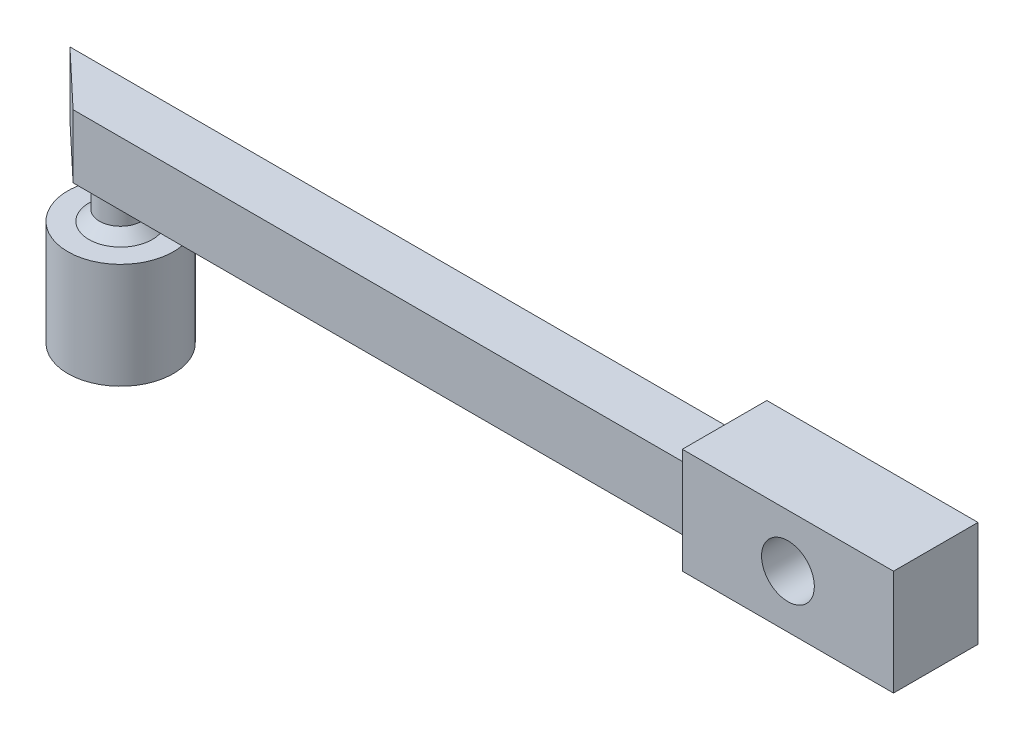
ISO-10303-21;
HEADER;
FILE_DESCRIPTION(('STEP AP214'),'2;1');
FILE_NAME('part.step','',(''),(''),'','','');
FILE_SCHEMA(('AUTOMOTIVE_DESIGN { 1 0 10303 214 1 1 1 1 }'));
ENDSEC;
DATA;
#1=APPLICATION_CONTEXT('core data for automotive mechanical design processes');
#2=APPLICATION_PROTOCOL_DEFINITION('international standard','automotive_design',2000,#1);
#3=PRODUCT_CONTEXT('',#1,'mechanical');
#4=PRODUCT('Part','Part','',(#3));
#5=PRODUCT_RELATED_PRODUCT_CATEGORY('part','',(#4));
#6=PRODUCT_DEFINITION_FORMATION('','',#4);
#7=PRODUCT_DEFINITION_CONTEXT('part definition',#1,'design');
#8=PRODUCT_DEFINITION('design','',#6,#7);
#9=PRODUCT_DEFINITION_SHAPE('','',#8);
#10=(LENGTH_UNIT() NAMED_UNIT(*) SI_UNIT(.MILLI.,.METRE.));
#11=(NAMED_UNIT(*) PLANE_ANGLE_UNIT() SI_UNIT($,.RADIAN.));
#12=(NAMED_UNIT(*) SI_UNIT($,.STERADIAN.) SOLID_ANGLE_UNIT());
#13=UNCERTAINTY_MEASURE_WITH_UNIT(LENGTH_MEASURE(1.E-05),#10,'distance_accuracy_value','');
#14=(GEOMETRIC_REPRESENTATION_CONTEXT(3) GLOBAL_UNCERTAINTY_ASSIGNED_CONTEXT((#13)) GLOBAL_UNIT_ASSIGNED_CONTEXT((#10,
#11,#12)) REPRESENTATION_CONTEXT('',''));
#15=CARTESIAN_POINT('',(0.,0.,0.));
#16=DIRECTION('',(0.,0.,1.));
#17=DIRECTION('',(1.,0.,0.));
#18=AXIS2_PLACEMENT_3D('',#15,#16,#17);
#19=CARTESIAN_POINT('',(-12.85,-8.2,1.25));
#20=DIRECTION('',(0.,1.,0.));
#21=DIRECTION('',(-1.,0.,0.));
#22=AXIS2_PLACEMENT_3D('',#19,#20,#21);
#23=CYLINDRICAL_SURFACE('',#22,2.5);
#24=DIRECTION('',(0.,-1.,0.));
#25=VECTOR('',#24,1.);
#26=CARTESIAN_POINT('',(-14.35,-0.158618734850889,-0.750000000000001));
#27=LINE('',#26,#25);
#28=CARTESIAN_POINT('',(-14.35,-3.2,-0.75));
#29=VERTEX_POINT('',#28);
#30=CARTESIAN_POINT('',(-14.35,-8.2,-0.750000000000001));
#31=VERTEX_POINT('',#30);
#32=EDGE_CURVE('E57',#29,#31,#27,.T.);
#33=ORIENTED_EDGE('',*,*,#32,.T.);
#34=CARTESIAN_POINT('',(-12.85,-8.2,1.25));
#35=DIRECTION('',(0.,-1.,0.));
#36=DIRECTION('',(1.,0.,0.));
#37=AXIS2_PLACEMENT_3D('',#34,#35,#36);
#38=CIRCLE('',#37,2.5);
#39=CARTESIAN_POINT('',(-11.35,-8.2,-0.750000000000001));
#40=VERTEX_POINT('',#39);
#41=EDGE_CURVE('E122',#40,#31,#38,.T.);
#42=ORIENTED_EDGE('',*,*,#41,.F.);
#43=DIRECTION('',(0.,-1.,0.));
#44=VECTOR('',#43,1.);
#45=CARTESIAN_POINT('',(-11.35,-0.158618734850889,-0.750000000000001));
#46=LINE('',#45,#44);
#47=CARTESIAN_POINT('',(-11.35,-3.2,-0.750000000000001));
#48=VERTEX_POINT('',#47);
#49=EDGE_CURVE('E114',#48,#40,#46,.T.);
#50=ORIENTED_EDGE('',*,*,#49,.F.);
#51=CARTESIAN_POINT('',(-12.85,-3.2,1.25));
#52=DIRECTION('',(0.,-1.,0.));
#53=DIRECTION('',(1.,0.,0.));
#54=AXIS2_PLACEMENT_3D('',#51,#52,#53);
#55=CIRCLE('',#54,2.5);
#56=EDGE_CURVE('E124',#48,#29,#55,.T.);
#57=ORIENTED_EDGE('',*,*,#56,.T.);
#58=EDGE_LOOP('',(#33,#42,#50,#57));
#59=FACE_BOUND('',#58,.T.);
#60=ADVANCED_FACE('F40',(#59),#23,.T.);
#61=CARTESIAN_POINT('',(-12.85,-8.2,1.25));
#62=DIRECTION('',(0.,-1.,0.));
#63=DIRECTION('',(1.,0.,0.));
#64=AXIS2_PLACEMENT_3D('',#61,#62,#63);
#65=PLANE('',#64);
#66=ORIENTED_EDGE('',*,*,#41,.T.);
#67=DIRECTION('',(1.,0.,0.));
#68=VECTOR('',#67,1.);
#69=CARTESIAN_POINT('',(0.,-8.2,-0.750000000000001));
#70=LINE('',#69,#68);
#71=EDGE_CURVE('E111',#31,#40,#70,.T.);
#72=ORIENTED_EDGE('',*,*,#71,.T.);
#73=EDGE_LOOP('',(#66,#72));
#74=FACE_BOUND('',#73,.T.);
#75=ADVANCED_FACE('F127',(#74),#65,.T.);
#76=CARTESIAN_POINT('',(-12.85,-3.2,1.25));
#77=DIRECTION('',(0.,-1.,0.));
#78=DIRECTION('',(1.,0.,0.));
#79=AXIS2_PLACEMENT_3D('',#76,#77,#78);
#80=PLANE('',#79);
#81=CARTESIAN_POINT('',(-12.85,-3.2,1.25));
#82=DIRECTION('',(0.,-1.,0.));
#83=DIRECTION('',(1.,0.,0.));
#84=AXIS2_PLACEMENT_3D('',#81,#82,#83);
#85=CIRCLE('',#84,1.5);
#86=CARTESIAN_POINT('',(-11.35,-3.2,1.25));
#87=VERTEX_POINT('',#86);
#88=EDGE_CURVE('E50',#87,#87,#85,.T.);
#89=ORIENTED_EDGE('',*,*,#88,.T.);
#90=EDGE_LOOP('',(#89));
#91=FACE_BOUND('',#90,.T.);
#92=DIRECTION('',(-1.,0.,0.));
#93=VECTOR('',#92,1.);
#94=CARTESIAN_POINT('',(0.,-3.2,-0.750000000000001));
#95=LINE('',#94,#93);
#96=EDGE_CURVE('E397',#48,#29,#95,.T.);
#97=ORIENTED_EDGE('',*,*,#96,.T.);
#98=ORIENTED_EDGE('',*,*,#56,.F.);
#99=EDGE_LOOP('',(#97,#98));
#100=FACE_BOUND('',#99,.T.);
#101=ADVANCED_FACE('F177',(#91,#100),#80,.F.);
#102=CARTESIAN_POINT('',(16.5,-1.5,2.5));
#103=DIRECTION('',(0.,1.,0.));
#104=DIRECTION('',(-1.,0.,0.));
#105=AXIS2_PLACEMENT_3D('',#102,#103,#104);
#106=PLANE('',#105);
#107=CARTESIAN_POINT('',(-12.85,-1.5,1.25));
#108=DIRECTION('',(0.,1.,0.));
#109=DIRECTION('',(-1.,0.,0.));
#110=AXIS2_PLACEMENT_3D('',#107,#108,#109);
#111=CIRCLE('',#110,1.);
#112=CARTESIAN_POINT('',(-13.85,-1.5,1.25));
#113=VERTEX_POINT('',#112);
#114=EDGE_CURVE('E170',#113,#113,#111,.F.);
#115=ORIENTED_EDGE('',*,*,#114,.F.);
#116=EDGE_LOOP('',(#115));
#117=FACE_BOUND('',#116,.T.);
#118=DIRECTION('',(1.,0.,0.));
#119=VECTOR('',#118,1.);
#120=CARTESIAN_POINT('',(16.5,-1.5,2.5));
#121=LINE('',#120,#119);
#122=CARTESIAN_POINT('',(-13.85,-1.5,2.5));
#123=VERTEX_POINT('',#122);
#124=CARTESIAN_POINT('',(16.5,-1.5,2.5));
#125=VERTEX_POINT('',#124);
#126=EDGE_CURVE('E148',#123,#125,#121,.T.);
#127=ORIENTED_EDGE('',*,*,#126,.F.);
#128=DIRECTION('',(0.727393652509462,0.,0.686220426895719));
#129=VECTOR('',#128,1.);
#130=CARTESIAN_POINT('',(-16.5,-1.5,0.));
#131=LINE('',#130,#129);
#132=CARTESIAN_POINT('',(-16.5,-1.5,0.));
#133=VERTEX_POINT('',#132);
#134=EDGE_CURVE('E129',#133,#123,#131,.T.);
#135=ORIENTED_EDGE('',*,*,#134,.F.);
#136=DIRECTION('',(1.,0.,0.));
#137=VECTOR('',#136,1.);
#138=CARTESIAN_POINT('',(16.5,-1.5,0.));
#139=LINE('',#138,#137);
#140=CARTESIAN_POINT('',(26.5,-1.5,0.));
#141=VERTEX_POINT('',#140);
#142=EDGE_CURVE('E162',#133,#141,#139,.T.);
#143=ORIENTED_EDGE('',*,*,#142,.T.);
#144=DIRECTION('',(0.,0.,-1.));
#145=VECTOR('',#144,1.);
#146=CARTESIAN_POINT('',(26.5,-1.5,4.));
#147=LINE('',#146,#145);
#148=CARTESIAN_POINT('',(26.5,-1.5,4.));
#149=VERTEX_POINT('',#148);
#150=EDGE_CURVE('E242',#149,#141,#147,.T.);
#151=ORIENTED_EDGE('',*,*,#150,.F.);
#152=DIRECTION('',(-1.,0.,0.));
#153=VECTOR('',#152,1.);
#154=CARTESIAN_POINT('',(26.5,-1.5,4.));
#155=LINE('',#154,#153);
#156=CARTESIAN_POINT('',(16.5,-1.5,4.));
#157=VERTEX_POINT('',#156);
#158=EDGE_CURVE('E249',#149,#157,#155,.T.);
#159=ORIENTED_EDGE('',*,*,#158,.T.);
#160=DIRECTION('',(0.,0.,-1.));
#161=VECTOR('',#160,1.);
#162=CARTESIAN_POINT('',(16.5,-1.5,4.));
#163=LINE('',#162,#161);
#164=EDGE_CURVE('E231',#157,#125,#163,.T.);
#165=ORIENTED_EDGE('',*,*,#164,.T.);
#166=EDGE_LOOP('',(#127,#135,#143,#151,#159,#165));
#167=FACE_BOUND('',#166,.T.);
#168=ADVANCED_FACE('F217',(#117,#167),#106,.F.);
#169=CARTESIAN_POINT('',(16.5,1.5,2.5));
#170=DIRECTION('',(0.,-1.,0.));
#171=DIRECTION('',(1.,0.,0.));
#172=AXIS2_PLACEMENT_3D('',#169,#170,#171);
#173=PLANE('',#172);
#174=DIRECTION('',(-1.,0.,0.));
#175=VECTOR('',#174,1.);
#176=CARTESIAN_POINT('',(16.5,1.5,0.));
#177=LINE('',#176,#175);
#178=CARTESIAN_POINT('',(16.5,1.5,0.));
#179=VERTEX_POINT('',#178);
#180=CARTESIAN_POINT('',(-16.5,1.5,0.));
#181=VERTEX_POINT('',#180);
#182=EDGE_CURVE('E153',#179,#181,#177,.T.);
#183=ORIENTED_EDGE('',*,*,#182,.T.);
#184=DIRECTION('',(0.727393652509462,0.,0.686220426895719));
#185=VECTOR('',#184,1.);
#186=CARTESIAN_POINT('',(-16.5,1.5,0.));
#187=LINE('',#186,#185);
#188=CARTESIAN_POINT('',(-13.85,1.5,2.5));
#189=VERTEX_POINT('',#188);
#190=EDGE_CURVE('E133',#181,#189,#187,.T.);
#191=ORIENTED_EDGE('',*,*,#190,.T.);
#192=DIRECTION('',(-1.,0.,0.));
#193=VECTOR('',#192,1.);
#194=CARTESIAN_POINT('',(16.5,1.5,2.5));
#195=LINE('',#194,#193);
#196=CARTESIAN_POINT('',(16.5,1.5,2.5));
#197=VERTEX_POINT('',#196);
#198=EDGE_CURVE('E156',#197,#189,#195,.T.);
#199=ORIENTED_EDGE('',*,*,#198,.F.);
#200=DIRECTION('',(0.,0.,-1.));
#201=VECTOR('',#200,1.);
#202=CARTESIAN_POINT('',(16.5,1.5,2.5));
#203=LINE('',#202,#201);
#204=EDGE_CURVE('E66',#197,#179,#203,.T.);
#205=ORIENTED_EDGE('',*,*,#204,.T.);
#206=EDGE_LOOP('',(#183,#191,#199,#205));
#207=FACE_BOUND('',#206,.T.);
#208=ADVANCED_FACE('F211',(#207),#173,.F.);
#209=CARTESIAN_POINT('',(0.,0.,2.5));
#210=DIRECTION('',(0.,0.,1.));
#211=DIRECTION('',(1.,0.,0.));
#212=AXIS2_PLACEMENT_3D('',#209,#210,#211);
#213=PLANE('',#212);
#214=DIRECTION('',(0.,-1.,0.));
#215=VECTOR('',#214,1.);
#216=CARTESIAN_POINT('',(-13.85,1.5,2.5));
#217=LINE('',#216,#215);
#218=EDGE_CURVE('E142',#189,#123,#217,.T.);
#219=ORIENTED_EDGE('',*,*,#218,.T.);
#220=ORIENTED_EDGE('',*,*,#126,.T.);
#221=DIRECTION('',(0.,1.,0.));
#222=VECTOR('',#221,1.);
#223=CARTESIAN_POINT('',(16.5,-1.5,2.5));
#224=LINE('',#223,#222);
#225=EDGE_CURVE('E152',#125,#197,#224,.T.);
#226=ORIENTED_EDGE('',*,*,#225,.T.);
#227=ORIENTED_EDGE('',*,*,#198,.T.);
#228=EDGE_LOOP('',(#219,#220,#226,#227));
#229=FACE_BOUND('',#228,.T.);
#230=ADVANCED_FACE('F208',(#229),#213,.T.);
#231=CARTESIAN_POINT('',(0.,0.,0.));
#232=DIRECTION('',(0.,0.,1.));
#233=DIRECTION('',(1.,0.,0.));
#234=AXIS2_PLACEMENT_3D('',#231,#232,#233);
#235=PLANE('',#234);
#236=CARTESIAN_POINT('',(21.5,1.,0.));
#237=DIRECTION('',(0.,0.,1.));
#238=DIRECTION('',(1.,0.,0.));
#239=AXIS2_PLACEMENT_3D('',#236,#237,#238);
#240=CIRCLE('',#239,1.25);
#241=CARTESIAN_POINT('',(22.75,1.,0.));
#242=VERTEX_POINT('',#241);
#243=EDGE_CURVE('E263',#242,#242,#240,.T.);
#244=ORIENTED_EDGE('',*,*,#243,.T.);
#245=EDGE_LOOP('',(#244));
#246=FACE_BOUND('',#245,.T.);
#247=DIRECTION('',(0.,-1.,0.));
#248=VECTOR('',#247,1.);
#249=CARTESIAN_POINT('',(-16.5,-1.5,0.));
#250=LINE('',#249,#248);
#251=EDGE_CURVE('E147',#181,#133,#250,.T.);
#252=ORIENTED_EDGE('',*,*,#251,.F.);
#253=ORIENTED_EDGE('',*,*,#182,.F.);
#254=DIRECTION('',(0.,1.,0.));
#255=VECTOR('',#254,1.);
#256=CARTESIAN_POINT('',(16.5,-1.5,0.));
#257=LINE('',#256,#255);
#258=CARTESIAN_POINT('',(16.5,3.5,0.));
#259=VERTEX_POINT('',#258);
#260=EDGE_CURVE('E259',#179,#259,#257,.T.);
#261=ORIENTED_EDGE('',*,*,#260,.T.);
#262=DIRECTION('',(-1.,0.,0.));
#263=VECTOR('',#262,1.);
#264=CARTESIAN_POINT('',(26.5,3.5,0.));
#265=LINE('',#264,#263);
#266=CARTESIAN_POINT('',(26.5,3.5,0.));
#267=VERTEX_POINT('',#266);
#268=EDGE_CURVE('E135',#267,#259,#265,.T.);
#269=ORIENTED_EDGE('',*,*,#268,.F.);
#270=DIRECTION('',(0.,1.,0.));
#271=VECTOR('',#270,1.);
#272=CARTESIAN_POINT('',(26.5,-1.5,0.));
#273=LINE('',#272,#271);
#274=EDGE_CURVE('E239',#141,#267,#273,.T.);
#275=ORIENTED_EDGE('',*,*,#274,.F.);
#276=ORIENTED_EDGE('',*,*,#142,.F.);
#277=EDGE_LOOP('',(#252,#253,#261,#269,#275,#276));
#278=FACE_BOUND('',#277,.T.);
#279=ADVANCED_FACE('F206',(#246,#278),#235,.F.);
#280=CARTESIAN_POINT('',(-16.5,1.5,0.));
#281=DIRECTION('',(0.686220426895719,0.,-0.727393652509462));
#282=DIRECTION('',(-0.727393652509463,0.,-0.686220426895719));
#283=AXIS2_PLACEMENT_3D('',#280,#281,#282);
#284=PLANE('',#283);
#285=ORIENTED_EDGE('',*,*,#134,.T.);
#286=ORIENTED_EDGE('',*,*,#218,.F.);
#287=ORIENTED_EDGE('',*,*,#190,.F.);
#288=ORIENTED_EDGE('',*,*,#251,.T.);
#289=EDGE_LOOP('',(#285,#286,#287,#288));
#290=FACE_BOUND('',#289,.T.);
#291=ADVANCED_FACE('F191',(#290),#284,.F.);
#292=CARTESIAN_POINT('',(-12.85,-3.2,1.25));
#293=DIRECTION('',(0.,1.,0.));
#294=DIRECTION('',(-1.,0.,0.));
#295=AXIS2_PLACEMENT_3D('',#292,#293,#294);
#296=CYLINDRICAL_SURFACE('',#295,1.);
#297=CARTESIAN_POINT('',(-12.85,-2.7,1.25));
#298=DIRECTION('',(0.,-1.,0.));
#299=DIRECTION('',(0.,0.,-1.));
#300=AXIS2_PLACEMENT_3D('',#297,#298,#299);
#301=CIRCLE('',#300,1.);
#302=CARTESIAN_POINT('',(-12.85,-2.7,0.25));
#303=VERTEX_POINT('',#302);
#304=EDGE_CURVE('E11',#303,#303,#301,.F.);
#305=ORIENTED_EDGE('',*,*,#304,.T.);
#306=EDGE_LOOP('',(#305));
#307=FACE_BOUND('',#306,.T.);
#308=ORIENTED_EDGE('',*,*,#114,.T.);
#309=EDGE_LOOP('',(#308));
#310=FACE_BOUND('',#309,.T.);
#311=ADVANCED_FACE('F182',(#307,#310),#296,.T.);
#312=CARTESIAN_POINT('',(-12.85,-3.2,1.25));
#313=DIRECTION('',(0.,-1.,0.));
#314=DIRECTION('',(0.,0.,-1.));
#315=AXIS2_PLACEMENT_3D('',#312,#313,#314);
#316=CONICAL_SURFACE('',#315,1.5,0.785398163397451);
#317=ORIENTED_EDGE('',*,*,#304,.F.);
#318=EDGE_LOOP('',(#317));
#319=FACE_BOUND('',#318,.T.);
#320=ORIENTED_EDGE('',*,*,#88,.F.);
#321=EDGE_LOOP('',(#320));
#322=FACE_BOUND('',#321,.T.);
#323=ADVANCED_FACE('F43',(#319,#322),#316,.T.);
#324=CARTESIAN_POINT('',(16.5,0.,0.));
#325=DIRECTION('',(-1.,0.,0.));
#326=DIRECTION('',(0.,0.,1.));
#327=AXIS2_PLACEMENT_3D('',#324,#325,#326);
#328=PLANE('',#327);
#329=ORIENTED_EDGE('',*,*,#204,.F.);
#330=ORIENTED_EDGE('',*,*,#225,.F.);
#331=ORIENTED_EDGE('',*,*,#164,.F.);
#332=DIRECTION('',(0.,-1.,0.));
#333=VECTOR('',#332,1.);
#334=CARTESIAN_POINT('',(16.5,-1.5,4.));
#335=LINE('',#334,#333);
#336=CARTESIAN_POINT('',(16.5,3.5,4.));
#337=VERTEX_POINT('',#336);
#338=EDGE_CURVE('E266',#337,#157,#335,.T.);
#339=ORIENTED_EDGE('',*,*,#338,.F.);
#340=DIRECTION('',(0.,0.,1.));
#341=VECTOR('',#340,1.);
#342=CARTESIAN_POINT('',(16.5,3.5,4.));
#343=LINE('',#342,#341);
#344=EDGE_CURVE('E262',#259,#337,#343,.T.);
#345=ORIENTED_EDGE('',*,*,#344,.F.);
#346=ORIENTED_EDGE('',*,*,#260,.F.);
#347=EDGE_LOOP('',(#329,#330,#331,#339,#345,#346));
#348=FACE_BOUND('',#347,.T.);
#349=ADVANCED_FACE('F181',(#348),#328,.T.);
#350=CARTESIAN_POINT('',(26.5,3.5,4.));
#351=DIRECTION('',(0.,-1.,0.));
#352=DIRECTION('',(0.,0.,-1.));
#353=AXIS2_PLACEMENT_3D('',#350,#351,#352);
#354=PLANE('',#353);
#355=ORIENTED_EDGE('',*,*,#344,.T.);
#356=DIRECTION('',(-1.,0.,0.));
#357=VECTOR('',#356,1.);
#358=CARTESIAN_POINT('',(26.5,3.5,4.));
#359=LINE('',#358,#357);
#360=CARTESIAN_POINT('',(26.5,3.5,4.));
#361=VERTEX_POINT('',#360);
#362=EDGE_CURVE('E253',#361,#337,#359,.T.);
#363=ORIENTED_EDGE('',*,*,#362,.F.);
#364=DIRECTION('',(0.,0.,1.));
#365=VECTOR('',#364,1.);
#366=CARTESIAN_POINT('',(26.5,3.5,4.));
#367=LINE('',#366,#365);
#368=EDGE_CURVE('E255',#267,#361,#367,.T.);
#369=ORIENTED_EDGE('',*,*,#368,.F.);
#370=ORIENTED_EDGE('',*,*,#268,.T.);
#371=EDGE_LOOP('',(#355,#363,#369,#370));
#372=FACE_BOUND('',#371,.T.);
#373=ADVANCED_FACE('F189',(#372),#354,.F.);
#374=CARTESIAN_POINT('',(26.5,-1.5,4.));
#375=DIRECTION('',(0.,0.,-1.));
#376=DIRECTION('',(-1.,0.,0.));
#377=AXIS2_PLACEMENT_3D('',#374,#375,#376);
#378=PLANE('',#377);
#379=CARTESIAN_POINT('',(21.5,1.,4.));
#380=DIRECTION('',(0.,0.,1.));
#381=DIRECTION('',(1.,0.,0.));
#382=AXIS2_PLACEMENT_3D('',#379,#380,#381);
#383=CIRCLE('',#382,1.25);
#384=CARTESIAN_POINT('',(22.75,1.,4.));
#385=VERTEX_POINT('',#384);
#386=EDGE_CURVE('E391',#385,#385,#383,.T.);
#387=ORIENTED_EDGE('',*,*,#386,.F.);
#388=EDGE_LOOP('',(#387));
#389=FACE_BOUND('',#388,.T.);
#390=ORIENTED_EDGE('',*,*,#338,.T.);
#391=ORIENTED_EDGE('',*,*,#158,.F.);
#392=DIRECTION('',(0.,-1.,0.));
#393=VECTOR('',#392,1.);
#394=CARTESIAN_POINT('',(26.5,-1.5,4.));
#395=LINE('',#394,#393);
#396=EDGE_CURVE('E246',#361,#149,#395,.T.);
#397=ORIENTED_EDGE('',*,*,#396,.F.);
#398=ORIENTED_EDGE('',*,*,#362,.T.);
#399=EDGE_LOOP('',(#390,#391,#397,#398));
#400=FACE_BOUND('',#399,.T.);
#401=ADVANCED_FACE('F279',(#389,#400),#378,.F.);
#402=CARTESIAN_POINT('',(26.5,0.,0.));
#403=DIRECTION('',(-1.,0.,0.));
#404=DIRECTION('',(0.,0.,1.));
#405=AXIS2_PLACEMENT_3D('',#402,#403,#404);
#406=PLANE('',#405);
#407=ORIENTED_EDGE('',*,*,#274,.T.);
#408=ORIENTED_EDGE('',*,*,#368,.T.);
#409=ORIENTED_EDGE('',*,*,#396,.T.);
#410=ORIENTED_EDGE('',*,*,#150,.T.);
#411=EDGE_LOOP('',(#407,#408,#409,#410));
#412=FACE_BOUND('',#411,.T.);
#413=ADVANCED_FACE('F244',(#412),#406,.F.);
#414=CARTESIAN_POINT('',(21.5,1.,-1.25));
#415=DIRECTION('',(0.,0.,1.));
#416=DIRECTION('',(1.,0.,0.));
#417=AXIS2_PLACEMENT_3D('',#414,#415,#416);
#418=CYLINDRICAL_SURFACE('',#417,1.25);
#419=ORIENTED_EDGE('',*,*,#386,.T.);
#420=EDGE_LOOP('',(#419));
#421=FACE_BOUND('',#420,.T.);
#422=ORIENTED_EDGE('',*,*,#243,.F.);
#423=EDGE_LOOP('',(#422));
#424=FACE_BOUND('',#423,.T.);
#425=ADVANCED_FACE('F287',(#421,#424),#418,.F.);
#426=CARTESIAN_POINT('',(0.,-0.158618734850889,-0.750000000000001));
#427=DIRECTION('',(0.,0.,-1.));
#428=DIRECTION('',(-1.,0.,0.));
#429=AXIS2_PLACEMENT_3D('',#426,#427,#428);
#430=PLANE('',#429);
#431=ORIENTED_EDGE('',*,*,#49,.T.);
#432=ORIENTED_EDGE('',*,*,#71,.F.);
#433=ORIENTED_EDGE('',*,*,#32,.F.);
#434=ORIENTED_EDGE('',*,*,#96,.F.);
#435=EDGE_LOOP('',(#431,#432,#433,#434));
#436=FACE_BOUND('',#435,.T.);
#437=ADVANCED_FACE('F112',(#436),#430,.T.);
#438=CLOSED_SHELL('',(#60,#75,#101,#168,#208,#230,#279,#291,#311,#323,#349,#373,#401,#413,#425,#437));
#439=MANIFOLD_SOLID_BREP('B2',#438);
#440=ADVANCED_BREP_SHAPE_REPRESENTATION('',(#18,#439),#14);
#441=SHAPE_DEFINITION_REPRESENTATION(#9,#440);
ENDSEC;
END-ISO-10303-21;
